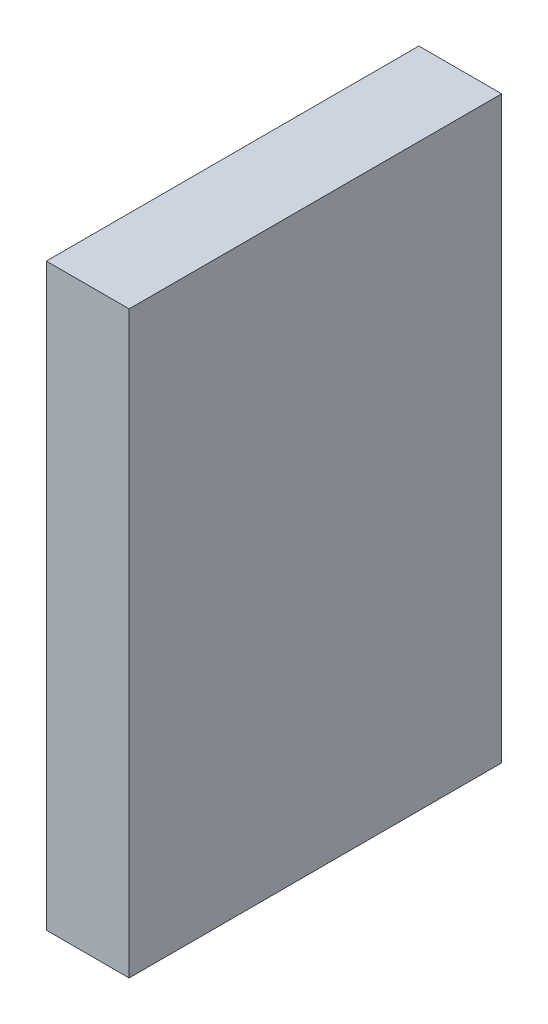
ISO-10303-21;
HEADER;
FILE_DESCRIPTION(('STEP AP214'),'2;1');
FILE_NAME('part.step','',(''),(''),'','','');
FILE_SCHEMA(('AUTOMOTIVE_DESIGN { 1 0 10303 214 1 1 1 1 }'));
ENDSEC;
DATA;
#1=APPLICATION_CONTEXT('core data for automotive mechanical design processes');
#2=APPLICATION_PROTOCOL_DEFINITION('international standard','automotive_design',2000,#1);
#3=PRODUCT_CONTEXT('',#1,'mechanical');
#4=PRODUCT('Part','Part','',(#3));
#5=PRODUCT_RELATED_PRODUCT_CATEGORY('part','',(#4));
#6=PRODUCT_DEFINITION_FORMATION('','',#4);
#7=PRODUCT_DEFINITION_CONTEXT('part definition',#1,'design');
#8=PRODUCT_DEFINITION('design','',#6,#7);
#9=PRODUCT_DEFINITION_SHAPE('','',#8);
#10=(LENGTH_UNIT() NAMED_UNIT(*) SI_UNIT(.MILLI.,.METRE.));
#11=(NAMED_UNIT(*) PLANE_ANGLE_UNIT() SI_UNIT($,.RADIAN.));
#12=(NAMED_UNIT(*) SI_UNIT($,.STERADIAN.) SOLID_ANGLE_UNIT());
#13=UNCERTAINTY_MEASURE_WITH_UNIT(LENGTH_MEASURE(1.E-05),#10,'distance_accuracy_value','');
#14=(GEOMETRIC_REPRESENTATION_CONTEXT(3) GLOBAL_UNCERTAINTY_ASSIGNED_CONTEXT((#13)) GLOBAL_UNIT_ASSIGNED_CONTEXT((#10,
#11,#12)) REPRESENTATION_CONTEXT('',''));
#15=CARTESIAN_POINT('',(0.,0.,0.));
#16=DIRECTION('',(0.,0.,1.));
#17=DIRECTION('',(1.,0.,0.));
#18=AXIS2_PLACEMENT_3D('',#15,#16,#17);
#19=CARTESIAN_POINT('',(10.,35.,22.5));
#20=DIRECTION('',(0.,0.,-1.));
#21=DIRECTION('',(0.,1.,0.));
#22=AXIS2_PLACEMENT_3D('',#19,#20,#21);
#23=PLANE('',#22);
#24=DIRECTION('',(0.,-1.,0.));
#25=VECTOR('',#24,1.);
#26=CARTESIAN_POINT('',(0.,35.,22.5));
#27=LINE('',#26,#25);
#28=CARTESIAN_POINT('',(0.,35.,22.5));
#29=VERTEX_POINT('',#28);
#30=CARTESIAN_POINT('',(0.,-35.,22.5));
#31=VERTEX_POINT('',#30);
#32=EDGE_CURVE('E97',#29,#31,#27,.T.);
#33=ORIENTED_EDGE('',*,*,#32,.T.);
#34=DIRECTION('',(-1.,0.,0.));
#35=VECTOR('',#34,1.);
#36=CARTESIAN_POINT('',(10.,-35.,22.5));
#37=LINE('',#36,#35);
#38=CARTESIAN_POINT('',(10.,-35.,22.5));
#39=VERTEX_POINT('',#38);
#40=EDGE_CURVE('E11',#39,#31,#37,.T.);
#41=ORIENTED_EDGE('',*,*,#40,.F.);
#42=DIRECTION('',(0.,-1.,0.));
#43=VECTOR('',#42,1.);
#44=CARTESIAN_POINT('',(10.,35.,22.5));
#45=LINE('',#44,#43);
#46=CARTESIAN_POINT('',(10.,35.,22.5));
#47=VERTEX_POINT('',#46);
#48=EDGE_CURVE('E85',#47,#39,#45,.T.);
#49=ORIENTED_EDGE('',*,*,#48,.F.);
#50=DIRECTION('',(-1.,0.,0.));
#51=VECTOR('',#50,1.);
#52=CARTESIAN_POINT('',(10.,35.,22.5));
#53=LINE('',#52,#51);
#54=EDGE_CURVE('E93',#47,#29,#53,.T.);
#55=ORIENTED_EDGE('',*,*,#54,.T.);
#56=EDGE_LOOP('',(#33,#41,#49,#55));
#57=FACE_BOUND('',#56,.T.);
#58=ADVANCED_FACE('F34',(#57),#23,.F.);
#59=CARTESIAN_POINT('',(10.,-35.,-22.5));
#60=DIRECTION('',(0.,1.,0.));
#61=DIRECTION('',(0.,0.,1.));
#62=AXIS2_PLACEMENT_3D('',#59,#60,#61);
#63=PLANE('',#62);
#64=DIRECTION('',(0.,0.,-1.));
#65=VECTOR('',#64,1.);
#66=CARTESIAN_POINT('',(0.,-35.,-22.5));
#67=LINE('',#66,#65);
#68=CARTESIAN_POINT('',(0.,-35.,-22.5));
#69=VERTEX_POINT('',#68);
#70=EDGE_CURVE('E89',#31,#69,#67,.T.);
#71=ORIENTED_EDGE('',*,*,#70,.T.);
#72=DIRECTION('',(-1.,0.,0.));
#73=VECTOR('',#72,1.);
#74=CARTESIAN_POINT('',(10.,-35.,-22.5));
#75=LINE('',#74,#73);
#76=CARTESIAN_POINT('',(10.,-35.,-22.5));
#77=VERTEX_POINT('',#76);
#78=EDGE_CURVE('E42',#77,#69,#75,.T.);
#79=ORIENTED_EDGE('',*,*,#78,.F.);
#80=DIRECTION('',(0.,0.,-1.));
#81=VECTOR('',#80,1.);
#82=CARTESIAN_POINT('',(10.,-35.,-22.5));
#83=LINE('',#82,#81);
#84=EDGE_CURVE('E80',#39,#77,#83,.T.);
#85=ORIENTED_EDGE('',*,*,#84,.F.);
#86=ORIENTED_EDGE('',*,*,#40,.T.);
#87=EDGE_LOOP('',(#71,#79,#85,#86));
#88=FACE_BOUND('',#87,.T.);
#89=ADVANCED_FACE('F88',(#88),#63,.F.);
#90=CARTESIAN_POINT('',(10.,35.,-22.5));
#91=DIRECTION('',(0.,0.,1.));
#92=DIRECTION('',(0.,-1.,0.));
#93=AXIS2_PLACEMENT_3D('',#90,#91,#92);
#94=PLANE('',#93);
#95=DIRECTION('',(0.,1.,0.));
#96=VECTOR('',#95,1.);
#97=CARTESIAN_POINT('',(0.,35.,-22.5));
#98=LINE('',#97,#96);
#99=CARTESIAN_POINT('',(0.,35.,-22.5));
#100=VERTEX_POINT('',#99);
#101=EDGE_CURVE('E67',#69,#100,#98,.T.);
#102=ORIENTED_EDGE('',*,*,#101,.T.);
#103=DIRECTION('',(-1.,0.,0.));
#104=VECTOR('',#103,1.);
#105=CARTESIAN_POINT('',(10.,35.,-22.5));
#106=LINE('',#105,#104);
#107=CARTESIAN_POINT('',(10.,35.,-22.5));
#108=VERTEX_POINT('',#107);
#109=EDGE_CURVE('E90',#108,#100,#106,.T.);
#110=ORIENTED_EDGE('',*,*,#109,.F.);
#111=DIRECTION('',(0.,1.,0.));
#112=VECTOR('',#111,1.);
#113=CARTESIAN_POINT('',(10.,35.,-22.5));
#114=LINE('',#113,#112);
#115=EDGE_CURVE('E83',#77,#108,#114,.T.);
#116=ORIENTED_EDGE('',*,*,#115,.F.);
#117=ORIENTED_EDGE('',*,*,#78,.T.);
#118=EDGE_LOOP('',(#102,#110,#116,#117));
#119=FACE_BOUND('',#118,.T.);
#120=ADVANCED_FACE('F91',(#119),#94,.F.);
#121=CARTESIAN_POINT('',(10.,35.,-22.5));
#122=DIRECTION('',(0.,-1.,0.));
#123=DIRECTION('',(0.,0.,-1.));
#124=AXIS2_PLACEMENT_3D('',#121,#122,#123);
#125=PLANE('',#124);
#126=DIRECTION('',(0.,0.,1.));
#127=VECTOR('',#126,1.);
#128=CARTESIAN_POINT('',(0.,35.,-22.5));
#129=LINE('',#128,#127);
#130=EDGE_CURVE('E73',#100,#29,#129,.T.);
#131=ORIENTED_EDGE('',*,*,#130,.T.);
#132=ORIENTED_EDGE('',*,*,#54,.F.);
#133=DIRECTION('',(0.,0.,1.));
#134=VECTOR('',#133,1.);
#135=CARTESIAN_POINT('',(10.,35.,-22.5));
#136=LINE('',#135,#134);
#137=EDGE_CURVE('E50',#108,#47,#136,.T.);
#138=ORIENTED_EDGE('',*,*,#137,.F.);
#139=ORIENTED_EDGE('',*,*,#109,.T.);
#140=EDGE_LOOP('',(#131,#132,#138,#139));
#141=FACE_BOUND('',#140,.T.);
#142=ADVANCED_FACE('F104',(#141),#125,.F.);
#143=CARTESIAN_POINT('',(10.,0.,0.));
#144=DIRECTION('',(-1.,0.,0.));
#145=DIRECTION('',(0.,0.,1.));
#146=AXIS2_PLACEMENT_3D('',#143,#144,#145);
#147=PLANE('',#146);
#148=ORIENTED_EDGE('',*,*,#48,.T.);
#149=ORIENTED_EDGE('',*,*,#84,.T.);
#150=ORIENTED_EDGE('',*,*,#115,.T.);
#151=ORIENTED_EDGE('',*,*,#137,.T.);
#152=EDGE_LOOP('',(#148,#149,#150,#151));
#153=FACE_BOUND('',#152,.T.);
#154=ADVANCED_FACE('F81',(#153),#147,.F.);
#155=CARTESIAN_POINT('',(0.,0.,0.));
#156=DIRECTION('',(-1.,0.,0.));
#157=DIRECTION('',(0.,0.,1.));
#158=AXIS2_PLACEMENT_3D('',#155,#156,#157);
#159=PLANE('',#158);
#160=ORIENTED_EDGE('',*,*,#32,.F.);
#161=ORIENTED_EDGE('',*,*,#130,.F.);
#162=ORIENTED_EDGE('',*,*,#101,.F.);
#163=ORIENTED_EDGE('',*,*,#70,.F.);
#164=EDGE_LOOP('',(#160,#161,#162,#163));
#165=FACE_BOUND('',#164,.T.);
#166=ADVANCED_FACE('F107',(#165),#159,.T.);
#167=CLOSED_SHELL('',(#58,#89,#120,#142,#154,#166));
#168=MANIFOLD_SOLID_BREP('B2',#167);
#169=ADVANCED_BREP_SHAPE_REPRESENTATION('',(#18,#168),#14);
#170=SHAPE_DEFINITION_REPRESENTATION(#9,#169);
ENDSEC;
END-ISO-10303-21;
